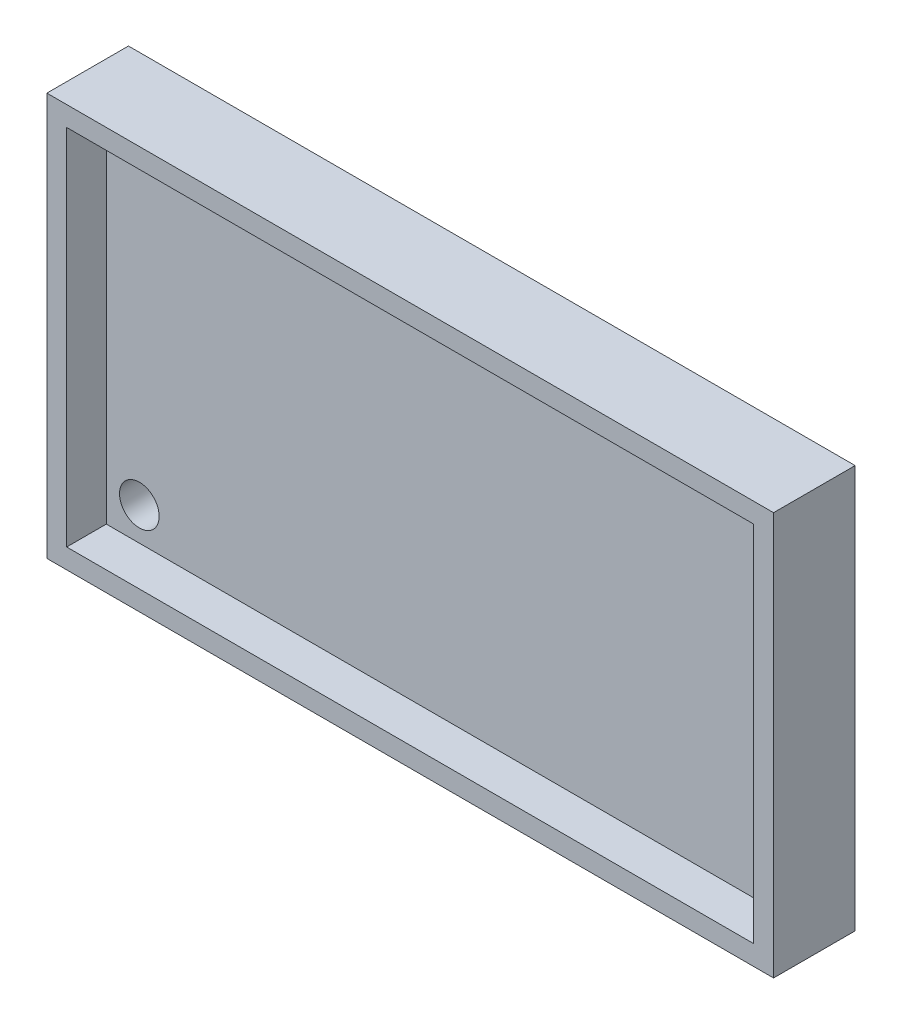
ISO-10303-21;
HEADER;
FILE_DESCRIPTION(('STEP AP214'),'2;1');
FILE_NAME('part.step','',(''),(''),'','','');
FILE_SCHEMA(('AUTOMOTIVE_DESIGN { 1 0 10303 214 1 1 1 1 }'));
ENDSEC;
DATA;
#1=APPLICATION_CONTEXT('core data for automotive mechanical design processes');
#2=APPLICATION_PROTOCOL_DEFINITION('international standard','automotive_design',2000,#1);
#3=PRODUCT_CONTEXT('',#1,'mechanical');
#4=PRODUCT('Part','Part','',(#3));
#5=PRODUCT_RELATED_PRODUCT_CATEGORY('part','',(#4));
#6=PRODUCT_DEFINITION_FORMATION('','',#4);
#7=PRODUCT_DEFINITION_CONTEXT('part definition',#1,'design');
#8=PRODUCT_DEFINITION('design','',#6,#7);
#9=PRODUCT_DEFINITION_SHAPE('','',#8);
#10=(LENGTH_UNIT() NAMED_UNIT(*) SI_UNIT(.MILLI.,.METRE.));
#11=(NAMED_UNIT(*) PLANE_ANGLE_UNIT() SI_UNIT($,.RADIAN.));
#12=(NAMED_UNIT(*) SI_UNIT($,.STERADIAN.) SOLID_ANGLE_UNIT());
#13=UNCERTAINTY_MEASURE_WITH_UNIT(LENGTH_MEASURE(1.E-05),#10,'distance_accuracy_value','');
#14=(GEOMETRIC_REPRESENTATION_CONTEXT(3) GLOBAL_UNCERTAINTY_ASSIGNED_CONTEXT((#13)) GLOBAL_UNIT_ASSIGNED_CONTEXT((#10,
#11,#12)) REPRESENTATION_CONTEXT('',''));
#15=CARTESIAN_POINT('',(0.,0.,0.));
#16=DIRECTION('',(0.,0.,1.));
#17=DIRECTION('',(1.,0.,0.));
#18=AXIS2_PLACEMENT_3D('',#15,#16,#17);
#19=CARTESIAN_POINT('',(0.,0.,6.35));
#20=DIRECTION('',(1.,0.,0.));
#21=DIRECTION('',(0.,1.,0.));
#22=AXIS2_PLACEMENT_3D('',#19,#20,#21);
#23=PLANE('',#22);
#24=DIRECTION('',(0.,-1.,0.));
#25=VECTOR('',#24,1.);
#26=CARTESIAN_POINT('',(0.,0.,0.));
#27=LINE('',#26,#25);
#28=CARTESIAN_POINT('',(0.,61.,0.));
#29=VERTEX_POINT('',#28);
#30=CARTESIAN_POINT('',(0.,0.,0.));
#31=VERTEX_POINT('',#30);
#32=EDGE_CURVE('E175',#29,#31,#27,.T.);
#33=ORIENTED_EDGE('',*,*,#32,.T.);
#34=DIRECTION('',(0.,0.,-1.));
#35=VECTOR('',#34,1.);
#36=CARTESIAN_POINT('',(0.,0.,6.35));
#37=LINE('',#36,#35);
#38=CARTESIAN_POINT('',(0.,0.,12.35));
#39=VERTEX_POINT('',#38);
#40=EDGE_CURVE('E11',#39,#31,#37,.T.);
#41=ORIENTED_EDGE('',*,*,#40,.F.);
#42=DIRECTION('',(0.,-1.,0.));
#43=VECTOR('',#42,1.);
#44=CARTESIAN_POINT('',(0.,61.,12.35));
#45=LINE('',#44,#43);
#46=CARTESIAN_POINT('',(0.,61.,12.35));
#47=VERTEX_POINT('',#46);
#48=EDGE_CURVE('E163',#47,#39,#45,.T.);
#49=ORIENTED_EDGE('',*,*,#48,.F.);
#50=DIRECTION('',(0.,0.,-1.));
#51=VECTOR('',#50,1.);
#52=CARTESIAN_POINT('',(0.,61.,6.35));
#53=LINE('',#52,#51);
#54=EDGE_CURVE('E187',#47,#29,#53,.T.);
#55=ORIENTED_EDGE('',*,*,#54,.T.);
#56=EDGE_LOOP('',(#33,#41,#49,#55));
#57=FACE_BOUND('',#56,.T.);
#58=ADVANCED_FACE('F39',(#57),#23,.F.);
#59=CARTESIAN_POINT('',(0.,0.,6.35));
#60=DIRECTION('',(0.,1.,0.));
#61=DIRECTION('',(0.,0.,1.));
#62=AXIS2_PLACEMENT_3D('',#59,#60,#61);
#63=PLANE('',#62);
#64=DIRECTION('',(1.,0.,0.));
#65=VECTOR('',#64,1.);
#66=CARTESIAN_POINT('',(0.,0.,0.));
#67=LINE('',#66,#65);
#68=CARTESIAN_POINT('',(110.,0.,0.));
#69=VERTEX_POINT('',#68);
#70=EDGE_CURVE('E179',#31,#69,#67,.T.);
#71=ORIENTED_EDGE('',*,*,#70,.T.);
#72=DIRECTION('',(0.,0.,-1.));
#73=VECTOR('',#72,1.);
#74=CARTESIAN_POINT('',(110.,0.,6.35));
#75=LINE('',#74,#73);
#76=CARTESIAN_POINT('',(110.,0.,12.35));
#77=VERTEX_POINT('',#76);
#78=EDGE_CURVE('E47',#77,#69,#75,.T.);
#79=ORIENTED_EDGE('',*,*,#78,.F.);
#80=DIRECTION('',(1.,0.,0.));
#81=VECTOR('',#80,1.);
#82=CARTESIAN_POINT('',(0.,0.,12.35));
#83=LINE('',#82,#81);
#84=EDGE_CURVE('E167',#39,#77,#83,.T.);
#85=ORIENTED_EDGE('',*,*,#84,.F.);
#86=ORIENTED_EDGE('',*,*,#40,.T.);
#87=EDGE_LOOP('',(#71,#79,#85,#86));
#88=FACE_BOUND('',#87,.T.);
#89=ADVANCED_FACE('F208',(#88),#63,.F.);
#90=CARTESIAN_POINT('',(110.,0.,6.35));
#91=DIRECTION('',(-1.,0.,0.));
#92=DIRECTION('',(0.,-1.,0.));
#93=AXIS2_PLACEMENT_3D('',#90,#91,#92);
#94=PLANE('',#93);
#95=DIRECTION('',(0.,1.,0.));
#96=VECTOR('',#95,1.);
#97=CARTESIAN_POINT('',(110.,0.,0.));
#98=LINE('',#97,#96);
#99=CARTESIAN_POINT('',(110.,61.,0.));
#100=VERTEX_POINT('',#99);
#101=EDGE_CURVE('E182',#69,#100,#98,.T.);
#102=ORIENTED_EDGE('',*,*,#101,.T.);
#103=DIRECTION('',(0.,0.,-1.));
#104=VECTOR('',#103,1.);
#105=CARTESIAN_POINT('',(110.,61.,6.35));
#106=LINE('',#105,#104);
#107=CARTESIAN_POINT('',(110.,61.,12.35));
#108=VERTEX_POINT('',#107);
#109=EDGE_CURVE('E190',#108,#100,#106,.T.);
#110=ORIENTED_EDGE('',*,*,#109,.F.);
#111=DIRECTION('',(0.,1.,0.));
#112=VECTOR('',#111,1.);
#113=CARTESIAN_POINT('',(110.,61.,12.35));
#114=LINE('',#113,#112);
#115=EDGE_CURVE('E171',#77,#108,#114,.T.);
#116=ORIENTED_EDGE('',*,*,#115,.F.);
#117=ORIENTED_EDGE('',*,*,#78,.T.);
#118=EDGE_LOOP('',(#102,#110,#116,#117));
#119=FACE_BOUND('',#118,.T.);
#120=ADVANCED_FACE('F197',(#119),#94,.F.);
#121=CARTESIAN_POINT('',(0.,61.,6.35));
#122=DIRECTION('',(0.,-1.,0.));
#123=DIRECTION('',(0.,0.,-1.));
#124=AXIS2_PLACEMENT_3D('',#121,#122,#123);
#125=PLANE('',#124);
#126=DIRECTION('',(-1.,0.,0.));
#127=VECTOR('',#126,1.);
#128=CARTESIAN_POINT('',(0.,61.,0.));
#129=LINE('',#128,#127);
#130=EDGE_CURVE('E62',#100,#29,#129,.T.);
#131=ORIENTED_EDGE('',*,*,#130,.T.);
#132=ORIENTED_EDGE('',*,*,#54,.F.);
#133=DIRECTION('',(-1.,0.,0.));
#134=VECTOR('',#133,1.);
#135=CARTESIAN_POINT('',(0.,61.,12.35));
#136=LINE('',#135,#134);
#137=EDGE_CURVE('E124',#108,#47,#136,.T.);
#138=ORIENTED_EDGE('',*,*,#137,.F.);
#139=ORIENTED_EDGE('',*,*,#109,.T.);
#140=EDGE_LOOP('',(#131,#132,#138,#139));
#141=FACE_BOUND('',#140,.T.);
#142=ADVANCED_FACE('F206',(#141),#125,.F.);
#143=CARTESIAN_POINT('',(0.,0.,0.));
#144=DIRECTION('',(0.,0.,-1.));
#145=DIRECTION('',(-1.,0.,0.));
#146=AXIS2_PLACEMENT_3D('',#143,#144,#145);
#147=PLANE('',#146);
#148=CARTESIAN_POINT('',(7.99999999999997,8.,0.));
#149=DIRECTION('',(0.,0.,1.));
#150=DIRECTION('',(1.,0.,0.));
#151=AXIS2_PLACEMENT_3D('',#148,#149,#150);
#152=CIRCLE('',#151,3.);
#153=CARTESIAN_POINT('',(11.,8.,0.));
#154=VERTEX_POINT('',#153);
#155=EDGE_CURVE('E143',#154,#154,#152,.T.);
#156=ORIENTED_EDGE('',*,*,#155,.T.);
#157=EDGE_LOOP('',(#156));
#158=FACE_BOUND('',#157,.T.);
#159=ORIENTED_EDGE('',*,*,#32,.F.);
#160=ORIENTED_EDGE('',*,*,#130,.F.);
#161=ORIENTED_EDGE('',*,*,#101,.F.);
#162=ORIENTED_EDGE('',*,*,#70,.F.);
#163=EDGE_LOOP('',(#159,#160,#161,#162));
#164=FACE_BOUND('',#163,.T.);
#165=ADVANCED_FACE('F202',(#158,#164),#147,.T.);
#166=CARTESIAN_POINT('',(0.,0.,12.35));
#167=DIRECTION('',(0.,0.,-1.));
#168=DIRECTION('',(-1.,0.,0.));
#169=AXIS2_PLACEMENT_3D('',#166,#167,#168);
#170=PLANE('',#169);
#171=ORIENTED_EDGE('',*,*,#137,.T.);
#172=ORIENTED_EDGE('',*,*,#48,.T.);
#173=ORIENTED_EDGE('',*,*,#84,.T.);
#174=ORIENTED_EDGE('',*,*,#115,.T.);
#175=EDGE_LOOP('',(#171,#172,#173,#174));
#176=FACE_BOUND('',#175,.T.);
#177=DIRECTION('',(0.,-1.,0.));
#178=VECTOR('',#177,1.);
#179=CARTESIAN_POINT('',(2.99999999999997,58.,12.35));
#180=LINE('',#179,#178);
#181=CARTESIAN_POINT('',(2.99999999999997,58.,12.35));
#182=VERTEX_POINT('',#181);
#183=CARTESIAN_POINT('',(2.99999999999998,3.,12.35));
#184=VERTEX_POINT('',#183);
#185=EDGE_CURVE('E106',#182,#184,#180,.T.);
#186=ORIENTED_EDGE('',*,*,#185,.F.);
#187=DIRECTION('',(-1.,0.,0.));
#188=VECTOR('',#187,1.);
#189=CARTESIAN_POINT('',(2.99999999999997,58.,12.35));
#190=LINE('',#189,#188);
#191=CARTESIAN_POINT('',(107.,58.,12.35));
#192=VERTEX_POINT('',#191);
#193=EDGE_CURVE('E134',#192,#182,#190,.T.);
#194=ORIENTED_EDGE('',*,*,#193,.F.);
#195=DIRECTION('',(0.,1.,0.));
#196=VECTOR('',#195,1.);
#197=CARTESIAN_POINT('',(107.,58.,12.35));
#198=LINE('',#197,#196);
#199=CARTESIAN_POINT('',(107.,3.,12.35));
#200=VERTEX_POINT('',#199);
#201=EDGE_CURVE('E130',#200,#192,#198,.T.);
#202=ORIENTED_EDGE('',*,*,#201,.F.);
#203=DIRECTION('',(1.,0.,0.));
#204=VECTOR('',#203,1.);
#205=CARTESIAN_POINT('',(2.99999999999998,3.,12.35));
#206=LINE('',#205,#204);
#207=EDGE_CURVE('E115',#184,#200,#206,.T.);
#208=ORIENTED_EDGE('',*,*,#207,.F.);
#209=EDGE_LOOP('',(#186,#194,#202,#208));
#210=FACE_BOUND('',#209,.T.);
#211=ADVANCED_FACE('F128',(#176,#210),#170,.F.);
#212=CARTESIAN_POINT('',(2.99999999999997,58.,12.35));
#213=DIRECTION('',(1.,0.,0.));
#214=DIRECTION('',(0.,1.,0.));
#215=AXIS2_PLACEMENT_3D('',#212,#213,#214);
#216=PLANE('',#215);
#217=DIRECTION('',(0.,-1.,0.));
#218=VECTOR('',#217,1.);
#219=CARTESIAN_POINT('',(2.99999999999997,58.,6.35));
#220=LINE('',#219,#218);
#221=CARTESIAN_POINT('',(2.99999999999997,58.,6.35));
#222=VERTEX_POINT('',#221);
#223=CARTESIAN_POINT('',(2.99999999999998,3.,6.35));
#224=VERTEX_POINT('',#223);
#225=EDGE_CURVE('E140',#222,#224,#220,.T.);
#226=ORIENTED_EDGE('',*,*,#225,.F.);
#227=DIRECTION('',(0.,0.,-1.));
#228=VECTOR('',#227,1.);
#229=CARTESIAN_POINT('',(2.99999999999997,58.,12.35));
#230=LINE('',#229,#228);
#231=EDGE_CURVE('E54',#182,#222,#230,.T.);
#232=ORIENTED_EDGE('',*,*,#231,.F.);
#233=ORIENTED_EDGE('',*,*,#185,.T.);
#234=DIRECTION('',(0.,0.,-1.));
#235=VECTOR('',#234,1.);
#236=CARTESIAN_POINT('',(2.99999999999998,3.,12.35));
#237=LINE('',#236,#235);
#238=EDGE_CURVE('E109',#184,#224,#237,.T.);
#239=ORIENTED_EDGE('',*,*,#238,.T.);
#240=EDGE_LOOP('',(#226,#232,#233,#239));
#241=FACE_BOUND('',#240,.T.);
#242=ADVANCED_FACE('F108',(#241),#216,.T.);
#243=CARTESIAN_POINT('',(2.99999999999998,3.,12.35));
#244=DIRECTION('',(0.,1.,0.));
#245=DIRECTION('',(0.,0.,1.));
#246=AXIS2_PLACEMENT_3D('',#243,#244,#245);
#247=PLANE('',#246);
#248=DIRECTION('',(1.,0.,0.));
#249=VECTOR('',#248,1.);
#250=CARTESIAN_POINT('',(2.99999999999998,3.,6.35));
#251=LINE('',#250,#249);
#252=CARTESIAN_POINT('',(107.,3.,6.35));
#253=VERTEX_POINT('',#252);
#254=EDGE_CURVE('E122',#224,#253,#251,.T.);
#255=ORIENTED_EDGE('',*,*,#254,.F.);
#256=ORIENTED_EDGE('',*,*,#238,.F.);
#257=ORIENTED_EDGE('',*,*,#207,.T.);
#258=DIRECTION('',(0.,0.,-1.));
#259=VECTOR('',#258,1.);
#260=CARTESIAN_POINT('',(107.,3.,12.35));
#261=LINE('',#260,#259);
#262=EDGE_CURVE('E125',#200,#253,#261,.T.);
#263=ORIENTED_EDGE('',*,*,#262,.T.);
#264=EDGE_LOOP('',(#255,#256,#257,#263));
#265=FACE_BOUND('',#264,.T.);
#266=ADVANCED_FACE('F119',(#265),#247,.T.);
#267=CARTESIAN_POINT('',(107.,58.,12.35));
#268=DIRECTION('',(-1.,0.,0.));
#269=DIRECTION('',(0.,0.,1.));
#270=AXIS2_PLACEMENT_3D('',#267,#268,#269);
#271=PLANE('',#270);
#272=DIRECTION('',(0.,1.,0.));
#273=VECTOR('',#272,1.);
#274=CARTESIAN_POINT('',(107.,58.,6.35));
#275=LINE('',#274,#273);
#276=CARTESIAN_POINT('',(107.,58.,6.35));
#277=VERTEX_POINT('',#276);
#278=EDGE_CURVE('E146',#253,#277,#275,.T.);
#279=ORIENTED_EDGE('',*,*,#278,.F.);
#280=ORIENTED_EDGE('',*,*,#262,.F.);
#281=ORIENTED_EDGE('',*,*,#201,.T.);
#282=DIRECTION('',(0.,0.,-1.));
#283=VECTOR('',#282,1.);
#284=CARTESIAN_POINT('',(107.,58.,12.35));
#285=LINE('',#284,#283);
#286=EDGE_CURVE('E155',#192,#277,#285,.T.);
#287=ORIENTED_EDGE('',*,*,#286,.T.);
#288=EDGE_LOOP('',(#279,#280,#281,#287));
#289=FACE_BOUND('',#288,.T.);
#290=ADVANCED_FACE('F233',(#289),#271,.T.);
#291=CARTESIAN_POINT('',(2.99999999999997,58.,12.35));
#292=DIRECTION('',(0.,-1.,0.));
#293=DIRECTION('',(0.,0.,-1.));
#294=AXIS2_PLACEMENT_3D('',#291,#292,#293);
#295=PLANE('',#294);
#296=DIRECTION('',(-1.,0.,0.));
#297=VECTOR('',#296,1.);
#298=CARTESIAN_POINT('',(2.99999999999997,58.,6.35));
#299=LINE('',#298,#297);
#300=EDGE_CURVE('E116',#277,#222,#299,.T.);
#301=ORIENTED_EDGE('',*,*,#300,.F.);
#302=ORIENTED_EDGE('',*,*,#286,.F.);
#303=ORIENTED_EDGE('',*,*,#193,.T.);
#304=ORIENTED_EDGE('',*,*,#231,.T.);
#305=EDGE_LOOP('',(#301,#302,#303,#304));
#306=FACE_BOUND('',#305,.T.);
#307=ADVANCED_FACE('F225',(#306),#295,.T.);
#308=CARTESIAN_POINT('',(0.,0.,6.35));
#309=DIRECTION('',(0.,0.,-1.));
#310=DIRECTION('',(-1.,0.,0.));
#311=AXIS2_PLACEMENT_3D('',#308,#309,#310);
#312=PLANE('',#311);
#313=CARTESIAN_POINT('',(7.99999999999997,8.,6.35));
#314=DIRECTION('',(0.,0.,1.));
#315=DIRECTION('',(1.,0.,0.));
#316=AXIS2_PLACEMENT_3D('',#313,#314,#315);
#317=CIRCLE('',#316,3.);
#318=CARTESIAN_POINT('',(11.,8.,6.35));
#319=VERTEX_POINT('',#318);
#320=EDGE_CURVE('E248',#319,#319,#317,.T.);
#321=ORIENTED_EDGE('',*,*,#320,.F.);
#322=EDGE_LOOP('',(#321));
#323=FACE_BOUND('',#322,.T.);
#324=ORIENTED_EDGE('',*,*,#300,.T.);
#325=ORIENTED_EDGE('',*,*,#225,.T.);
#326=ORIENTED_EDGE('',*,*,#254,.T.);
#327=ORIENTED_EDGE('',*,*,#278,.T.);
#328=EDGE_LOOP('',(#324,#325,#326,#327));
#329=FACE_BOUND('',#328,.T.);
#330=ADVANCED_FACE('F221',(#323,#329),#312,.F.);
#331=CARTESIAN_POINT('',(7.99999999999997,8.,0.));
#332=DIRECTION('',(0.,0.,1.));
#333=DIRECTION('',(1.,0.,0.));
#334=AXIS2_PLACEMENT_3D('',#331,#332,#333);
#335=CYLINDRICAL_SURFACE('',#334,3.);
#336=ORIENTED_EDGE('',*,*,#155,.F.);
#337=EDGE_LOOP('',(#336));
#338=FACE_BOUND('',#337,.T.);
#339=ORIENTED_EDGE('',*,*,#320,.T.);
#340=EDGE_LOOP('',(#339));
#341=FACE_BOUND('',#340,.T.);
#342=ADVANCED_FACE('F224',(#338,#341),#335,.F.);
#343=CLOSED_SHELL('',(#58,#89,#120,#142,#165,#211,#242,#266,#290,#307,#330,#342));
#344=MANIFOLD_SOLID_BREP('B2',#343);
#345=ADVANCED_BREP_SHAPE_REPRESENTATION('',(#18,#344),#14);
#346=SHAPE_DEFINITION_REPRESENTATION(#9,#345);
ENDSEC;
END-ISO-10303-21;
